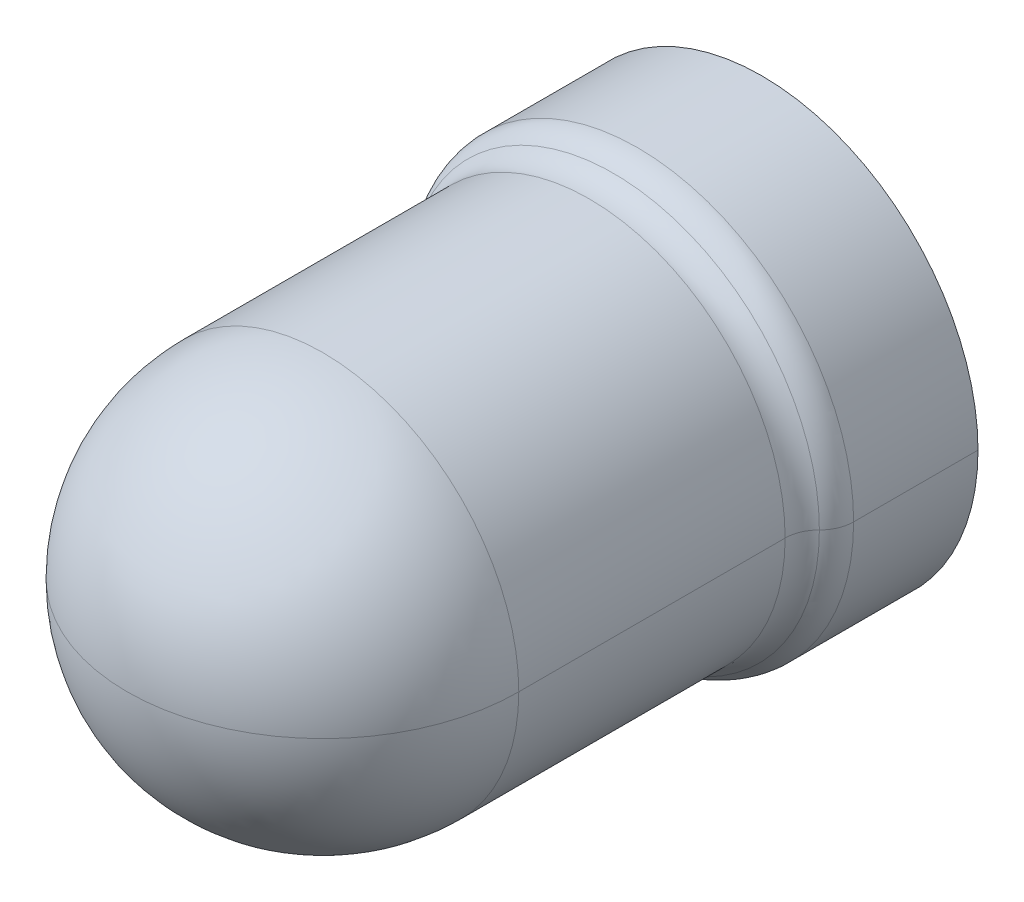
ISO-10303-21;
HEADER;
FILE_DESCRIPTION(('STEP AP214'),'2;1');
FILE_NAME('part.step','',(''),(''),'','','');
FILE_SCHEMA(('AUTOMOTIVE_DESIGN { 1 0 10303 214 1 1 1 1 }'));
ENDSEC;
DATA;
#1=APPLICATION_CONTEXT('core data for automotive mechanical design processes');
#2=APPLICATION_PROTOCOL_DEFINITION('international standard','automotive_design',2000,#1);
#3=PRODUCT_CONTEXT('',#1,'mechanical');
#4=PRODUCT('Part','Part','',(#3));
#5=PRODUCT_RELATED_PRODUCT_CATEGORY('part','',(#4));
#6=PRODUCT_DEFINITION_FORMATION('','',#4);
#7=PRODUCT_DEFINITION_CONTEXT('part definition',#1,'design');
#8=PRODUCT_DEFINITION('design','',#6,#7);
#9=PRODUCT_DEFINITION_SHAPE('','',#8);
#10=(LENGTH_UNIT() NAMED_UNIT(*) SI_UNIT(.MILLI.,.METRE.));
#11=(NAMED_UNIT(*) PLANE_ANGLE_UNIT() SI_UNIT($,.RADIAN.));
#12=(NAMED_UNIT(*) SI_UNIT($,.STERADIAN.) SOLID_ANGLE_UNIT());
#13=UNCERTAINTY_MEASURE_WITH_UNIT(LENGTH_MEASURE(1.E-05),#10,'distance_accuracy_value','');
#14=(GEOMETRIC_REPRESENTATION_CONTEXT(3) GLOBAL_UNCERTAINTY_ASSIGNED_CONTEXT((#13)) GLOBAL_UNIT_ASSIGNED_CONTEXT((#10,
#11,#12)) REPRESENTATION_CONTEXT('',''));
#15=CARTESIAN_POINT('',(0.,0.,0.));
#16=DIRECTION('',(0.,0.,1.));
#17=DIRECTION('',(1.,0.,0.));
#18=AXIS2_PLACEMENT_3D('',#15,#16,#17);
#19=CARTESIAN_POINT('',(0.,0.,1.277942636679));
#20=DIRECTION('',(0.,0.,-1.));
#21=DIRECTION('',(-1.,0.,0.));
#22=AXIS2_PLACEMENT_3D('',#19,#20,#21);
#23=TOROIDAL_SURFACE('',#22,1.7,0.25);
#24=CARTESIAN_POINT('',(1.7,0.,1.277942636679));
#25=DIRECTION('',(0.,1.,0.));
#26=DIRECTION('',(-1.,0.,0.));
#27=AXIS2_PLACEMENT_3D('',#24,#25,#26);
#28=CIRCLE('',#27,0.25);
#29=CARTESIAN_POINT('',(1.525,0.,1.099406925966));
#30=VERTEX_POINT('',#29);
#31=CARTESIAN_POINT('',(1.45,0.,1.277942636679));
#32=VERTEX_POINT('',#31);
#33=EDGE_CURVE('E125',#30,#32,#28,.T.);
#34=ORIENTED_EDGE('',*,*,#33,.F.);
#35=CARTESIAN_POINT('',(0.,0.,1.099406925966));
#36=DIRECTION('',(0.,0.,1.));
#37=DIRECTION('',(1.,0.,0.));
#38=AXIS2_PLACEMENT_3D('',#35,#36,#37);
#39=CIRCLE('',#38,1.525);
#40=CARTESIAN_POINT('',(-1.525,0.,1.099406925966));
#41=VERTEX_POINT('',#40);
#42=EDGE_CURVE('E27',#30,#41,#39,.T.);
#43=ORIENTED_EDGE('',*,*,#42,.T.);
#44=CARTESIAN_POINT('',(-1.7,0.,1.277942636679));
#45=DIRECTION('',(0.,-1.,0.));
#46=DIRECTION('',(0.,0.,-1.));
#47=AXIS2_PLACEMENT_3D('',#44,#45,#46);
#48=CIRCLE('',#47,0.25);
#49=CARTESIAN_POINT('',(-1.45,0.,1.277942636679));
#50=VERTEX_POINT('',#49);
#51=EDGE_CURVE('E131',#41,#50,#48,.T.);
#52=ORIENTED_EDGE('',*,*,#51,.T.);
#53=CARTESIAN_POINT('',(0.,0.,1.277942636679));
#54=DIRECTION('',(0.,0.,-1.));
#55=DIRECTION('',(1.,0.,0.));
#56=AXIS2_PLACEMENT_3D('',#53,#54,#55);
#57=CIRCLE('',#56,1.45);
#58=EDGE_CURVE('E11',#50,#32,#57,.T.);
#59=ORIENTED_EDGE('',*,*,#58,.T.);
#60=EDGE_LOOP('',(#34,#43,#52,#59));
#61=FACE_BOUND('',#60,.T.);
#62=ADVANCED_FACE('F16',(#61),#23,.F.);
#63=CARTESIAN_POINT('',(0.,0.,1.15));
#64=DIRECTION('',(0.,0.,1.));
#65=DIRECTION('',(-1.,0.,0.));
#66=AXIS2_PLACEMENT_3D('',#63,#64,#65);
#67=CYLINDRICAL_SURFACE('',#66,1.45);
#68=DIRECTION('',(0.,0.,1.));
#69=VECTOR('',#68,1.);
#70=CARTESIAN_POINT('',(1.45,0.,1.15));
#71=LINE('',#70,#69);
#72=CARTESIAN_POINT('',(1.45,0.,3.25));
#73=VERTEX_POINT('',#72);
#74=EDGE_CURVE('E126',#32,#73,#71,.T.);
#75=ORIENTED_EDGE('',*,*,#74,.F.);
#76=ORIENTED_EDGE('',*,*,#58,.F.);
#77=DIRECTION('',(0.,0.,1.));
#78=VECTOR('',#77,1.);
#79=CARTESIAN_POINT('',(-1.45,0.,1.15));
#80=LINE('',#79,#78);
#81=CARTESIAN_POINT('',(-1.45,0.,3.25));
#82=VERTEX_POINT('',#81);
#83=EDGE_CURVE('E134',#50,#82,#80,.T.);
#84=ORIENTED_EDGE('',*,*,#83,.T.);
#85=CARTESIAN_POINT('',(0.,0.,3.25));
#86=DIRECTION('',(0.,0.,1.));
#87=DIRECTION('',(-1.,0.,0.));
#88=AXIS2_PLACEMENT_3D('',#85,#86,#87);
#89=CIRCLE('',#88,1.45);
#90=EDGE_CURVE('E120',#73,#82,#89,.T.);
#91=ORIENTED_EDGE('',*,*,#90,.F.);
#92=EDGE_LOOP('',(#75,#76,#84,#91));
#93=FACE_BOUND('',#92,.T.);
#94=ADVANCED_FACE('F264',(#93),#67,.T.);
#95=CARTESIAN_POINT('',(0.,0.,0.920871215252));
#96=DIRECTION('',(0.,0.,-1.));
#97=DIRECTION('',(1.,0.,0.));
#98=AXIS2_PLACEMENT_3D('',#95,#96,#97);
#99=TOROIDAL_SURFACE('',#98,1.35,0.25);
#100=CARTESIAN_POINT('',(-1.35,0.,0.920871215252));
#101=DIRECTION('',(0.,-1.,0.));
#102=DIRECTION('',(1.,0.,0.));
#103=AXIS2_PLACEMENT_3D('',#100,#101,#102);
#104=CIRCLE('',#103,0.25);
#105=CARTESIAN_POINT('',(-1.6,0.,0.920871215252));
#106=VERTEX_POINT('',#105);
#107=EDGE_CURVE('E152',#41,#106,#104,.T.);
#108=ORIENTED_EDGE('',*,*,#107,.F.);
#109=ORIENTED_EDGE('',*,*,#42,.F.);
#110=CARTESIAN_POINT('',(1.35,0.,0.920871215252));
#111=DIRECTION('',(0.,1.,0.));
#112=DIRECTION('',(0.,0.,1.));
#113=AXIS2_PLACEMENT_3D('',#110,#111,#112);
#114=CIRCLE('',#113,0.25);
#115=CARTESIAN_POINT('',(1.6,0.,0.920871215252));
#116=VERTEX_POINT('',#115);
#117=EDGE_CURVE('E107',#30,#116,#114,.T.);
#118=ORIENTED_EDGE('',*,*,#117,.T.);
#119=CARTESIAN_POINT('',(0.,0.,0.920871215252));
#120=DIRECTION('',(0.,0.,1.));
#121=DIRECTION('',(1.,0.,0.));
#122=AXIS2_PLACEMENT_3D('',#119,#120,#121);
#123=CIRCLE('',#122,1.6);
#124=EDGE_CURVE('E20',#116,#106,#123,.T.);
#125=ORIENTED_EDGE('',*,*,#124,.T.);
#126=EDGE_LOOP('',(#108,#109,#118,#125));
#127=FACE_BOUND('',#126,.T.);
#128=ADVANCED_FACE('F260',(#127),#99,.T.);
#129=CARTESIAN_POINT('',(0.,0.,0.));
#130=DIRECTION('',(0.,0.,1.));
#131=DIRECTION('',(-1.,0.,0.));
#132=AXIS2_PLACEMENT_3D('',#129,#130,#131);
#133=CYLINDRICAL_SURFACE('',#132,1.6);
#134=DIRECTION('',(0.,0.,1.));
#135=VECTOR('',#134,1.);
#136=CARTESIAN_POINT('',(1.6,0.,0.));
#137=LINE('',#136,#135);
#138=CARTESIAN_POINT('',(1.6,0.,0.));
#139=VERTEX_POINT('',#138);
#140=EDGE_CURVE('E98',#139,#116,#137,.T.);
#141=ORIENTED_EDGE('',*,*,#140,.F.);
#142=CARTESIAN_POINT('',(0.,0.,0.));
#143=DIRECTION('',(0.,0.,-1.));
#144=DIRECTION('',(-1.,0.,0.));
#145=AXIS2_PLACEMENT_3D('',#142,#143,#144);
#146=CIRCLE('',#145,1.6);
#147=CARTESIAN_POINT('',(-1.6,0.,0.));
#148=VERTEX_POINT('',#147);
#149=EDGE_CURVE('E88',#148,#139,#146,.T.);
#150=ORIENTED_EDGE('',*,*,#149,.F.);
#151=DIRECTION('',(0.,0.,1.));
#152=VECTOR('',#151,1.);
#153=CARTESIAN_POINT('',(-1.6,0.,0.));
#154=LINE('',#153,#152);
#155=EDGE_CURVE('E103',#148,#106,#154,.T.);
#156=ORIENTED_EDGE('',*,*,#155,.T.);
#157=ORIENTED_EDGE('',*,*,#124,.F.);
#158=EDGE_LOOP('',(#141,#150,#156,#157));
#159=FACE_BOUND('',#158,.T.);
#160=ADVANCED_FACE('F99',(#159),#133,.T.);
#161=CARTESIAN_POINT('',(0.,0.,3.25));
#162=DIRECTION('',(0.,1.,0.));
#163=DIRECTION('',(1.,0.,0.));
#164=AXIS2_PLACEMENT_3D('',#161,#162,#163);
#165=SPHERICAL_SURFACE('',#164,1.45);
#166=CARTESIAN_POINT('',(0.,0.,3.25));
#167=DIRECTION('',(0.,1.,0.));
#168=DIRECTION('',(-1.,0.,0.));
#169=AXIS2_PLACEMENT_3D('',#166,#167,#168);
#170=CIRCLE('',#169,1.45);
#171=CARTESIAN_POINT('',(0.,0.,4.7));
#172=VERTEX_POINT('',#171);
#173=EDGE_CURVE('E74',#82,#172,#170,.T.);
#174=ORIENTED_EDGE('',*,*,#173,.F.);
#175=CARTESIAN_POINT('',(0.,0.,3.25));
#176=DIRECTION('',(0.,0.,1.));
#177=DIRECTION('',(-1.,0.,0.));
#178=AXIS2_PLACEMENT_3D('',#175,#176,#177);
#179=CIRCLE('',#178,1.45);
#180=EDGE_CURVE('E130',#82,#73,#179,.T.);
#181=ORIENTED_EDGE('',*,*,#180,.T.);
#182=CARTESIAN_POINT('',(0.,0.,3.25));
#183=DIRECTION('',(0.,-1.,0.));
#184=DIRECTION('',(0.,0.,-1.));
#185=AXIS2_PLACEMENT_3D('',#182,#183,#184);
#186=CIRCLE('',#185,1.45);
#187=EDGE_CURVE('E42',#73,#172,#186,.T.);
#188=ORIENTED_EDGE('',*,*,#187,.T.);
#189=EDGE_LOOP('',(#174,#181,#188));
#190=FACE_BOUND('',#189,.T.);
#191=ADVANCED_FACE('F295',(#190),#165,.T.);
#192=CARTESIAN_POINT('',(0.,0.,0.));
#193=DIRECTION('',(0.,0.,1.));
#194=DIRECTION('',(1.,0.,0.));
#195=AXIS2_PLACEMENT_3D('',#192,#193,#194);
#196=PLANE('',#195);
#197=ORIENTED_EDGE('',*,*,#149,.T.);
#198=CARTESIAN_POINT('',(0.,0.,0.));
#199=DIRECTION('',(0.,0.,-1.));
#200=DIRECTION('',(-1.,0.,0.));
#201=AXIS2_PLACEMENT_3D('',#198,#199,#200);
#202=CIRCLE('',#201,1.6);
#203=EDGE_CURVE('E92',#139,#148,#202,.T.);
#204=ORIENTED_EDGE('',*,*,#203,.T.);
#205=EDGE_LOOP('',(#197,#204));
#206=FACE_BOUND('',#205,.T.);
#207=ADVANCED_FACE('F90',(#206),#196,.F.);
#208=CARTESIAN_POINT('',(0.,0.,3.25));
#209=DIRECTION('',(0.,1.,0.));
#210=DIRECTION('',(1.,0.,0.));
#211=AXIS2_PLACEMENT_3D('',#208,#209,#210);
#212=SPHERICAL_SURFACE('',#211,1.45);
#213=ORIENTED_EDGE('',*,*,#90,.T.);
#214=ORIENTED_EDGE('',*,*,#173,.T.);
#215=ORIENTED_EDGE('',*,*,#187,.F.);
#216=EDGE_LOOP('',(#213,#214,#215));
#217=FACE_BOUND('',#216,.T.);
#218=ADVANCED_FACE('F269',(#217),#212,.T.);
#219=CARTESIAN_POINT('',(0.,0.,0.));
#220=DIRECTION('',(0.,0.,1.));
#221=DIRECTION('',(-1.,0.,0.));
#222=AXIS2_PLACEMENT_3D('',#219,#220,#221);
#223=CYLINDRICAL_SURFACE('',#222,1.6);
#224=ORIENTED_EDGE('',*,*,#203,.F.);
#225=ORIENTED_EDGE('',*,*,#140,.T.);
#226=CARTESIAN_POINT('',(0.,0.,0.920871215252));
#227=DIRECTION('',(0.,0.,1.));
#228=DIRECTION('',(1.,0.,0.));
#229=AXIS2_PLACEMENT_3D('',#226,#227,#228);
#230=CIRCLE('',#229,1.6);
#231=EDGE_CURVE('E113',#106,#116,#230,.T.);
#232=ORIENTED_EDGE('',*,*,#231,.F.);
#233=ORIENTED_EDGE('',*,*,#155,.F.);
#234=EDGE_LOOP('',(#224,#225,#232,#233));
#235=FACE_BOUND('',#234,.T.);
#236=ADVANCED_FACE('F105',(#235),#223,.T.);
#237=CARTESIAN_POINT('',(0.,0.,0.920871215252));
#238=DIRECTION('',(0.,0.,-1.));
#239=DIRECTION('',(1.,0.,0.));
#240=AXIS2_PLACEMENT_3D('',#237,#238,#239);
#241=TOROIDAL_SURFACE('',#240,1.35,0.25);
#242=CARTESIAN_POINT('',(0.,0.,1.099406925966));
#243=DIRECTION('',(0.,0.,1.));
#244=DIRECTION('',(1.,0.,0.));
#245=AXIS2_PLACEMENT_3D('',#242,#243,#244);
#246=CIRCLE('',#245,1.525);
#247=EDGE_CURVE('E121',#41,#30,#246,.T.);
#248=ORIENTED_EDGE('',*,*,#247,.F.);
#249=ORIENTED_EDGE('',*,*,#107,.T.);
#250=ORIENTED_EDGE('',*,*,#231,.T.);
#251=ORIENTED_EDGE('',*,*,#117,.F.);
#252=EDGE_LOOP('',(#248,#249,#250,#251));
#253=FACE_BOUND('',#252,.T.);
#254=ADVANCED_FACE('F18',(#253),#241,.T.);
#255=CARTESIAN_POINT('',(0.,0.,1.15));
#256=DIRECTION('',(0.,0.,1.));
#257=DIRECTION('',(-1.,0.,0.));
#258=AXIS2_PLACEMENT_3D('',#255,#256,#257);
#259=CYLINDRICAL_SURFACE('',#258,1.45);
#260=CARTESIAN_POINT('',(0.,0.,1.277942636679));
#261=DIRECTION('',(0.,0.,-1.));
#262=DIRECTION('',(1.,0.,0.));
#263=AXIS2_PLACEMENT_3D('',#260,#261,#262);
#264=CIRCLE('',#263,1.45);
#265=EDGE_CURVE('E141',#32,#50,#264,.T.);
#266=ORIENTED_EDGE('',*,*,#265,.F.);
#267=ORIENTED_EDGE('',*,*,#74,.T.);
#268=ORIENTED_EDGE('',*,*,#180,.F.);
#269=ORIENTED_EDGE('',*,*,#83,.F.);
#270=EDGE_LOOP('',(#266,#267,#268,#269));
#271=FACE_BOUND('',#270,.T.);
#272=ADVANCED_FACE('F176',(#271),#259,.T.);
#273=CARTESIAN_POINT('',(0.,0.,1.277942636679));
#274=DIRECTION('',(0.,0.,-1.));
#275=DIRECTION('',(-1.,0.,0.));
#276=AXIS2_PLACEMENT_3D('',#273,#274,#275);
#277=TOROIDAL_SURFACE('',#276,1.7,0.25);
#278=ORIENTED_EDGE('',*,*,#247,.T.);
#279=ORIENTED_EDGE('',*,*,#33,.T.);
#280=ORIENTED_EDGE('',*,*,#265,.T.);
#281=ORIENTED_EDGE('',*,*,#51,.F.);
#282=EDGE_LOOP('',(#278,#279,#280,#281));
#283=FACE_BOUND('',#282,.T.);
#284=ADVANCED_FACE('F172',(#283),#277,.F.);
#285=CLOSED_SHELL('',(#62,#94,#128,#160,#191,#207,#218,#236,#254,#272,#284));
#286=MANIFOLD_SOLID_BREP('B1',#285);
#287=ADVANCED_BREP_SHAPE_REPRESENTATION('',(#18,#286),#14);
#288=SHAPE_DEFINITION_REPRESENTATION(#9,#287);
ENDSEC;
END-ISO-10303-21;
